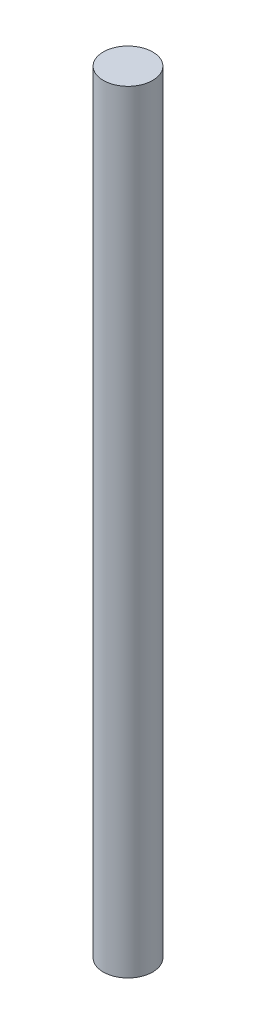
ISO-10303-21;
HEADER;
FILE_DESCRIPTION(('STEP AP214'),'2;1');
FILE_NAME('part.step','',(''),(''),'','','');
FILE_SCHEMA(('AUTOMOTIVE_DESIGN { 1 0 10303 214 1 1 1 1 }'));
ENDSEC;
DATA;
#1=APPLICATION_CONTEXT('core data for automotive mechanical design processes');
#2=APPLICATION_PROTOCOL_DEFINITION('international standard','automotive_design',2000,#1);
#3=PRODUCT_CONTEXT('',#1,'mechanical');
#4=PRODUCT('Part','Part','',(#3));
#5=PRODUCT_RELATED_PRODUCT_CATEGORY('part','',(#4));
#6=PRODUCT_DEFINITION_FORMATION('','',#4);
#7=PRODUCT_DEFINITION_CONTEXT('part definition',#1,'design');
#8=PRODUCT_DEFINITION('design','',#6,#7);
#9=PRODUCT_DEFINITION_SHAPE('','',#8);
#10=(LENGTH_UNIT() NAMED_UNIT(*) SI_UNIT(.MILLI.,.METRE.));
#11=(NAMED_UNIT(*) PLANE_ANGLE_UNIT() SI_UNIT($,.RADIAN.));
#12=(NAMED_UNIT(*) SI_UNIT($,.STERADIAN.) SOLID_ANGLE_UNIT());
#13=UNCERTAINTY_MEASURE_WITH_UNIT(LENGTH_MEASURE(1.E-05),#10,'distance_accuracy_value','');
#14=(GEOMETRIC_REPRESENTATION_CONTEXT(3) GLOBAL_UNCERTAINTY_ASSIGNED_CONTEXT((#13)) GLOBAL_UNIT_ASSIGNED_CONTEXT((#10,
#11,#12)) REPRESENTATION_CONTEXT('',''));
#15=CARTESIAN_POINT('',(0.,0.,0.));
#16=DIRECTION('',(0.,0.,1.));
#17=DIRECTION('',(1.,0.,0.));
#18=AXIS2_PLACEMENT_3D('',#15,#16,#17);
#19=CARTESIAN_POINT('',(0.,136.413119773671,0.));
#20=DIRECTION('',(0.,-1.,0.));
#21=DIRECTION('',(0.,0.,-1.));
#22=AXIS2_PLACEMENT_3D('',#19,#20,#21);
#23=CYLINDRICAL_SURFACE('',#22,4.);
#24=CARTESIAN_POINT('',(0.,0.,0.));
#25=DIRECTION('',(0.,1.,0.));
#26=DIRECTION('',(0.,0.,1.));
#27=AXIS2_PLACEMENT_3D('',#24,#25,#26);
#28=CIRCLE('',#27,4.);
#29=CARTESIAN_POINT('',(0.,0.,4.));
#30=VERTEX_POINT('',#29);
#31=EDGE_CURVE('E38',#30,#30,#28,.T.);
#32=ORIENTED_EDGE('',*,*,#31,.T.);
#33=EDGE_LOOP('',(#32));
#34=FACE_BOUND('',#33,.T.);
#35=CARTESIAN_POINT('',(0.,125.099411274686,0.));
#36=DIRECTION('',(0.,1.,0.));
#37=DIRECTION('',(0.,0.,1.));
#38=AXIS2_PLACEMENT_3D('',#35,#36,#37);
#39=CIRCLE('',#38,4.);
#40=CARTESIAN_POINT('',(0.,125.099411274686,4.));
#41=VERTEX_POINT('',#40);
#42=EDGE_CURVE('E10',#41,#41,#39,.T.);
#43=ORIENTED_EDGE('',*,*,#42,.F.);
#44=EDGE_LOOP('',(#43));
#45=FACE_BOUND('',#44,.T.);
#46=ADVANCED_FACE('F31',(#34,#45),#23,.T.);
#47=CARTESIAN_POINT('',(0.,0.,0.));
#48=DIRECTION('',(0.,1.,0.));
#49=DIRECTION('',(0.,0.,1.));
#50=AXIS2_PLACEMENT_3D('',#47,#48,#49);
#51=PLANE('',#50);
#52=ORIENTED_EDGE('',*,*,#31,.F.);
#53=EDGE_LOOP('',(#52));
#54=FACE_BOUND('',#53,.T.);
#55=ADVANCED_FACE('F46',(#54),#51,.F.);
#56=CARTESIAN_POINT('',(-7.46600072813827,125.099411274686,0.769523528407262));
#57=DIRECTION('',(0.,1.,0.));
#58=DIRECTION('',(-0.10252721914008,0.,-0.994730199267823));
#59=AXIS2_PLACEMENT_3D('',#56,#57,#58);
#60=PLANE('',#59);
#61=ORIENTED_EDGE('',*,*,#42,.T.);
#62=EDGE_LOOP('',(#61));
#63=FACE_BOUND('',#62,.T.);
#64=ADVANCED_FACE('F33',(#63),#60,.T.);
#65=CLOSED_SHELL('',(#46,#55,#64));
#66=MANIFOLD_SOLID_BREP('B2',#65);
#67=ADVANCED_BREP_SHAPE_REPRESENTATION('',(#18,#66),#14);
#68=SHAPE_DEFINITION_REPRESENTATION(#9,#67);
ENDSEC;
END-ISO-10303-21;
